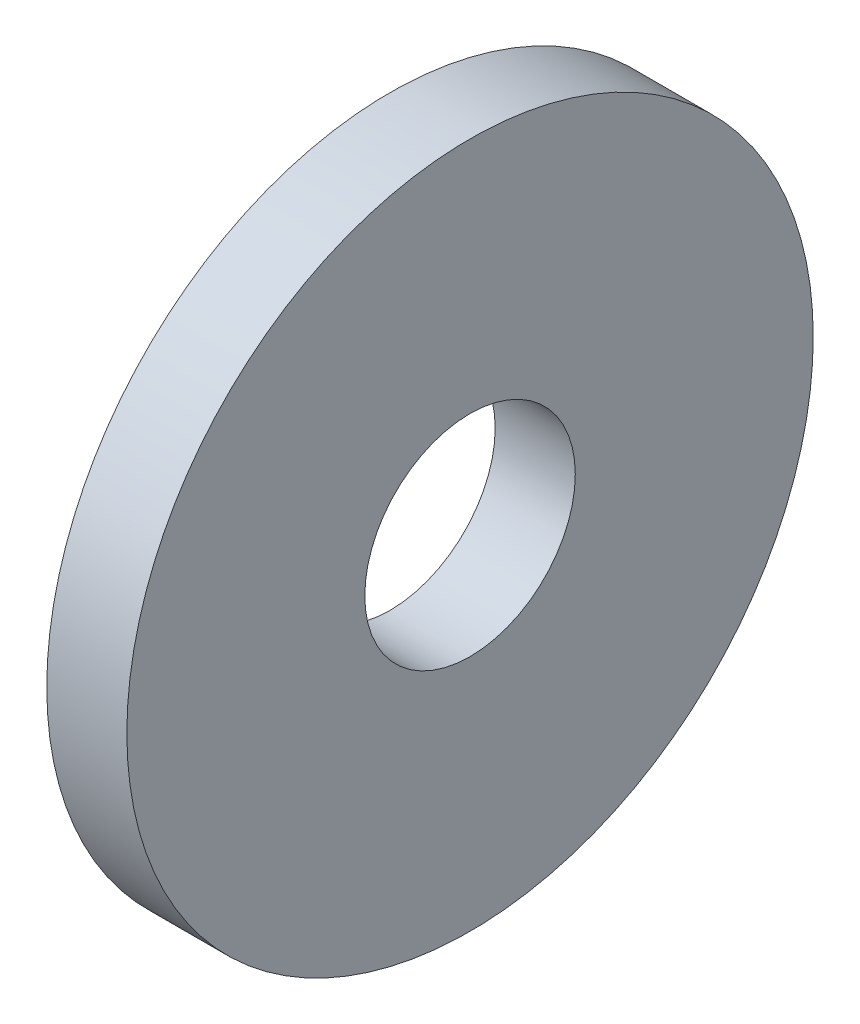
ISO-10303-21;
HEADER;
FILE_DESCRIPTION(('STEP AP214'),'2;1');
FILE_NAME('part.step','',(''),(''),'','','');
FILE_SCHEMA(('AUTOMOTIVE_DESIGN { 1 0 10303 214 1 1 1 1 }'));
ENDSEC;
DATA;
#1=APPLICATION_CONTEXT('core data for automotive mechanical design processes');
#2=APPLICATION_PROTOCOL_DEFINITION('international standard','automotive_design',2000,#1);
#3=PRODUCT_CONTEXT('',#1,'mechanical');
#4=PRODUCT('Part','Part','',(#3));
#5=PRODUCT_RELATED_PRODUCT_CATEGORY('part','',(#4));
#6=PRODUCT_DEFINITION_FORMATION('','',#4);
#7=PRODUCT_DEFINITION_CONTEXT('part definition',#1,'design');
#8=PRODUCT_DEFINITION('design','',#6,#7);
#9=PRODUCT_DEFINITION_SHAPE('','',#8);
#10=(LENGTH_UNIT() NAMED_UNIT(*) SI_UNIT(.MILLI.,.METRE.));
#11=(NAMED_UNIT(*) PLANE_ANGLE_UNIT() SI_UNIT($,.RADIAN.));
#12=(NAMED_UNIT(*) SI_UNIT($,.STERADIAN.) SOLID_ANGLE_UNIT());
#13=UNCERTAINTY_MEASURE_WITH_UNIT(LENGTH_MEASURE(1.E-05),#10,'distance_accuracy_value','');
#14=(GEOMETRIC_REPRESENTATION_CONTEXT(3) GLOBAL_UNCERTAINTY_ASSIGNED_CONTEXT((#13)) GLOBAL_UNIT_ASSIGNED_CONTEXT((#10,
#11,#12)) REPRESENTATION_CONTEXT('',''));
#15=CARTESIAN_POINT('',(0.,0.,0.));
#16=DIRECTION('',(0.,0.,1.));
#17=DIRECTION('',(1.,0.,0.));
#18=AXIS2_PLACEMENT_3D('',#15,#16,#17);
#19=CARTESIAN_POINT('',(-34.9249999999999,0.,0.));
#20=DIRECTION('',(-1.,0.,0.));
#21=DIRECTION('',(0.,0.,1.));
#22=AXIS2_PLACEMENT_3D('',#19,#20,#21);
#23=CYLINDRICAL_SURFACE('',#22,1.84);
#24=CARTESIAN_POINT('',(0.,0.,0.));
#25=DIRECTION('',(-1.,0.,0.));
#26=DIRECTION('',(0.,0.,1.));
#27=AXIS2_PLACEMENT_3D('',#24,#25,#26);
#28=CIRCLE('',#27,1.84);
#29=CARTESIAN_POINT('',(0.,0.,1.84));
#30=VERTEX_POINT('',#29);
#31=EDGE_CURVE('E10',#30,#30,#28,.T.);
#32=ORIENTED_EDGE('',*,*,#31,.F.);
#33=EDGE_LOOP('',(#32));
#34=FACE_BOUND('',#33,.T.);
#35=CARTESIAN_POINT('',(-1.4,0.,0.));
#36=DIRECTION('',(-1.,0.,0.));
#37=DIRECTION('',(0.,0.,1.));
#38=AXIS2_PLACEMENT_3D('',#35,#36,#37);
#39=CIRCLE('',#38,1.84);
#40=CARTESIAN_POINT('',(-1.4,0.,1.84));
#41=VERTEX_POINT('',#40);
#42=EDGE_CURVE('E44',#41,#41,#39,.T.);
#43=ORIENTED_EDGE('',*,*,#42,.T.);
#44=EDGE_LOOP('',(#43));
#45=FACE_BOUND('',#44,.T.);
#46=ADVANCED_FACE('F30',(#34,#45),#23,.F.);
#47=CARTESIAN_POINT('',(0.,1.84,0.));
#48=DIRECTION('',(-1.,0.,0.));
#49=DIRECTION('',(0.,0.,1.));
#50=AXIS2_PLACEMENT_3D('',#47,#48,#49);
#51=PLANE('',#50);
#52=CARTESIAN_POINT('',(0.,0.,0.));
#53=DIRECTION('',(-1.,0.,0.));
#54=DIRECTION('',(0.,0.,1.));
#55=AXIS2_PLACEMENT_3D('',#52,#53,#54);
#56=CIRCLE('',#55,6.);
#57=CARTESIAN_POINT('',(0.,0.,6.));
#58=VERTEX_POINT('',#57);
#59=EDGE_CURVE('E36',#58,#58,#56,.T.);
#60=ORIENTED_EDGE('',*,*,#59,.F.);
#61=EDGE_LOOP('',(#60));
#62=FACE_BOUND('',#61,.T.);
#63=ORIENTED_EDGE('',*,*,#31,.T.);
#64=EDGE_LOOP('',(#63));
#65=FACE_BOUND('',#64,.T.);
#66=ADVANCED_FACE('F59',(#62,#65),#51,.F.);
#67=CARTESIAN_POINT('',(-34.9249999999999,0.,0.));
#68=DIRECTION('',(-1.,0.,0.));
#69=DIRECTION('',(0.,0.,1.));
#70=AXIS2_PLACEMENT_3D('',#67,#68,#69);
#71=CYLINDRICAL_SURFACE('',#70,6.);
#72=CARTESIAN_POINT('',(-1.4,0.,0.));
#73=DIRECTION('',(-1.,0.,0.));
#74=DIRECTION('',(0.,0.,1.));
#75=AXIS2_PLACEMENT_3D('',#72,#73,#74);
#76=CIRCLE('',#75,6.);
#77=CARTESIAN_POINT('',(-1.4,0.,6.));
#78=VERTEX_POINT('',#77);
#79=EDGE_CURVE('E40',#78,#78,#76,.T.);
#80=ORIENTED_EDGE('',*,*,#79,.F.);
#81=EDGE_LOOP('',(#80));
#82=FACE_BOUND('',#81,.T.);
#83=ORIENTED_EDGE('',*,*,#59,.T.);
#84=EDGE_LOOP('',(#83));
#85=FACE_BOUND('',#84,.T.);
#86=ADVANCED_FACE('F54',(#82,#85),#71,.T.);
#87=CARTESIAN_POINT('',(-1.4,6.,0.));
#88=DIRECTION('',(1.,0.,0.));
#89=DIRECTION('',(0.,0.,-1.));
#90=AXIS2_PLACEMENT_3D('',#87,#88,#89);
#91=PLANE('',#90);
#92=ORIENTED_EDGE('',*,*,#42,.F.);
#93=EDGE_LOOP('',(#92));
#94=FACE_BOUND('',#93,.T.);
#95=ORIENTED_EDGE('',*,*,#79,.T.);
#96=EDGE_LOOP('',(#95));
#97=FACE_BOUND('',#96,.T.);
#98=ADVANCED_FACE('F51',(#94,#97),#91,.F.);
#99=CLOSED_SHELL('',(#46,#66,#86,#98));
#100=MANIFOLD_SOLID_BREP('B2',#99);
#101=ADVANCED_BREP_SHAPE_REPRESENTATION('',(#18,#100),#14);
#102=SHAPE_DEFINITION_REPRESENTATION(#9,#101);
ENDSEC;
END-ISO-10303-21;
